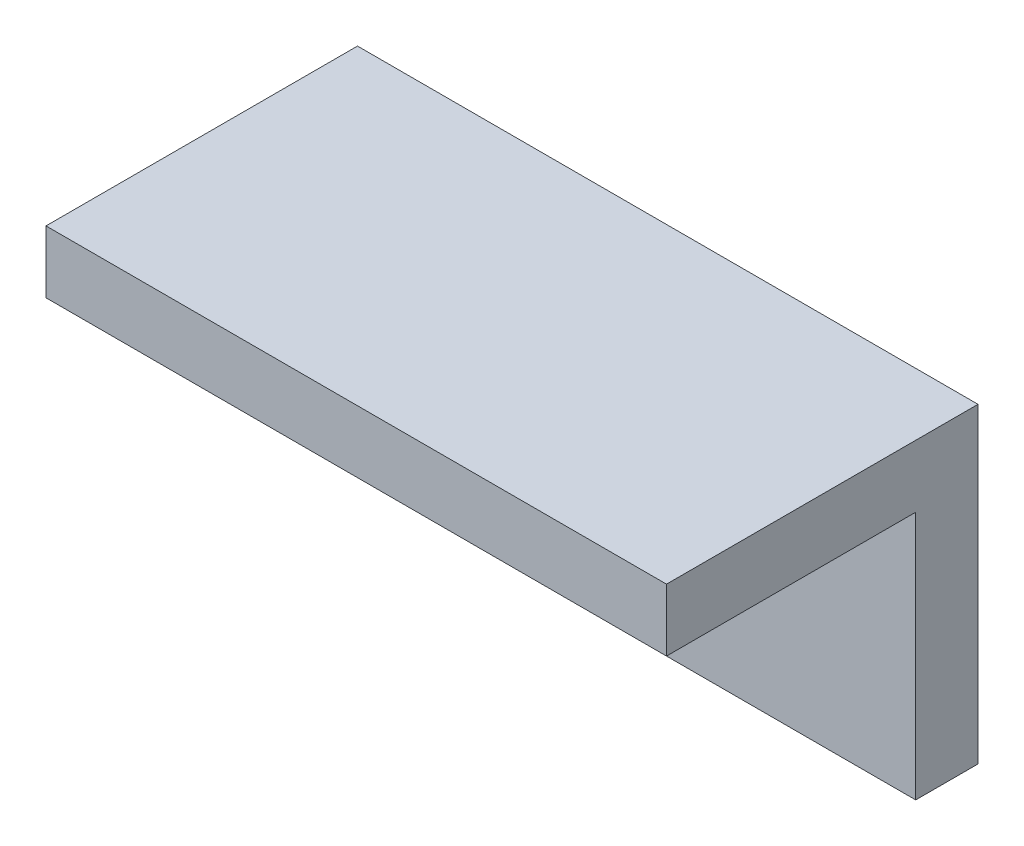
ISO-10303-21;
HEADER;
FILE_DESCRIPTION(('STEP AP214'),'2;1');
FILE_NAME('part.step','',(''),(''),'','','');
FILE_SCHEMA(('AUTOMOTIVE_DESIGN { 1 0 10303 214 1 1 1 1 }'));
ENDSEC;
DATA;
#1=APPLICATION_CONTEXT('core data for automotive mechanical design processes');
#2=APPLICATION_PROTOCOL_DEFINITION('international standard','automotive_design',2000,#1);
#3=PRODUCT_CONTEXT('',#1,'mechanical');
#4=PRODUCT('Part','Part','',(#3));
#5=PRODUCT_RELATED_PRODUCT_CATEGORY('part','',(#4));
#6=PRODUCT_DEFINITION_FORMATION('','',#4);
#7=PRODUCT_DEFINITION_CONTEXT('part definition',#1,'design');
#8=PRODUCT_DEFINITION('design','',#6,#7);
#9=PRODUCT_DEFINITION_SHAPE('','',#8);
#10=(LENGTH_UNIT() NAMED_UNIT(*) SI_UNIT(.MILLI.,.METRE.));
#11=(NAMED_UNIT(*) PLANE_ANGLE_UNIT() SI_UNIT($,.RADIAN.));
#12=(NAMED_UNIT(*) SI_UNIT($,.STERADIAN.) SOLID_ANGLE_UNIT());
#13=UNCERTAINTY_MEASURE_WITH_UNIT(LENGTH_MEASURE(1.E-05),#10,'distance_accuracy_value','');
#14=(GEOMETRIC_REPRESENTATION_CONTEXT(3) GLOBAL_UNCERTAINTY_ASSIGNED_CONTEXT((#13)) GLOBAL_UNIT_ASSIGNED_CONTEXT((#10,
#11,#12)) REPRESENTATION_CONTEXT('',''));
#15=CARTESIAN_POINT('',(0.,0.,0.));
#16=DIRECTION('',(0.,0.,1.));
#17=DIRECTION('',(1.,0.,0.));
#18=AXIS2_PLACEMENT_3D('',#15,#16,#17);
#19=CARTESIAN_POINT('',(31.623,0.,3.175));
#20=DIRECTION('',(0.,1.,0.));
#21=DIRECTION('',(0.,0.,1.));
#22=AXIS2_PLACEMENT_3D('',#19,#20,#21);
#23=PLANE('',#22);
#24=DIRECTION('',(0.,0.,-1.));
#25=VECTOR('',#24,1.);
#26=CARTESIAN_POINT('',(0.,0.,3.175));
#27=LINE('',#26,#25);
#28=CARTESIAN_POINT('',(0.,0.,3.175));
#29=VERTEX_POINT('',#28);
#30=CARTESIAN_POINT('',(0.,0.,0.));
#31=VERTEX_POINT('',#30);
#32=EDGE_CURVE('E128',#29,#31,#27,.T.);
#33=ORIENTED_EDGE('',*,*,#32,.T.);
#34=DIRECTION('',(-1.,0.,0.));
#35=VECTOR('',#34,1.);
#36=CARTESIAN_POINT('',(31.623,0.,0.));
#37=LINE('',#36,#35);
#38=CARTESIAN_POINT('',(31.623,0.,0.));
#39=VERTEX_POINT('',#38);
#40=EDGE_CURVE('E11',#39,#31,#37,.T.);
#41=ORIENTED_EDGE('',*,*,#40,.F.);
#42=DIRECTION('',(0.,0.,-1.));
#43=VECTOR('',#42,1.);
#44=CARTESIAN_POINT('',(31.623,0.,3.175));
#45=LINE('',#44,#43);
#46=CARTESIAN_POINT('',(31.623,0.,3.175));
#47=VERTEX_POINT('',#46);
#48=EDGE_CURVE('E144',#47,#39,#45,.T.);
#49=ORIENTED_EDGE('',*,*,#48,.F.);
#50=DIRECTION('',(-1.,0.,0.));
#51=VECTOR('',#50,1.);
#52=CARTESIAN_POINT('',(31.623,0.,3.175));
#53=LINE('',#52,#51);
#54=EDGE_CURVE('E124',#47,#29,#53,.T.);
#55=ORIENTED_EDGE('',*,*,#54,.T.);
#56=EDGE_LOOP('',(#33,#41,#49,#55));
#57=FACE_BOUND('',#56,.T.);
#58=ADVANCED_FACE('F39',(#57),#23,.F.);
#59=CARTESIAN_POINT('',(31.623,0.,0.));
#60=DIRECTION('',(0.,0.,1.));
#61=DIRECTION('',(1.,0.,0.));
#62=AXIS2_PLACEMENT_3D('',#59,#60,#61);
#63=PLANE('',#62);
#64=DIRECTION('',(0.,1.,0.));
#65=VECTOR('',#64,1.);
#66=CARTESIAN_POINT('',(0.,0.,0.));
#67=LINE('',#66,#65);
#68=CARTESIAN_POINT('',(0.,15.875,0.));
#69=VERTEX_POINT('',#68);
#70=EDGE_CURVE('E132',#31,#69,#67,.T.);
#71=ORIENTED_EDGE('',*,*,#70,.T.);
#72=DIRECTION('',(-1.,0.,0.));
#73=VECTOR('',#72,1.);
#74=CARTESIAN_POINT('',(31.623,15.875,0.));
#75=LINE('',#74,#73);
#76=CARTESIAN_POINT('',(31.623,15.875,0.));
#77=VERTEX_POINT('',#76);
#78=EDGE_CURVE('E48',#77,#69,#75,.T.);
#79=ORIENTED_EDGE('',*,*,#78,.F.);
#80=DIRECTION('',(0.,1.,0.));
#81=VECTOR('',#80,1.);
#82=CARTESIAN_POINT('',(31.623,0.,0.));
#83=LINE('',#82,#81);
#84=EDGE_CURVE('E93',#39,#77,#83,.T.);
#85=ORIENTED_EDGE('',*,*,#84,.F.);
#86=ORIENTED_EDGE('',*,*,#40,.T.);
#87=EDGE_LOOP('',(#71,#79,#85,#86));
#88=FACE_BOUND('',#87,.T.);
#89=ADVANCED_FACE('F172',(#88),#63,.F.);
#90=CARTESIAN_POINT('',(31.623,15.875,0.));
#91=DIRECTION('',(0.,-1.,0.));
#92=DIRECTION('',(0.,0.,-1.));
#93=AXIS2_PLACEMENT_3D('',#90,#91,#92);
#94=PLANE('',#93);
#95=DIRECTION('',(0.,0.,1.));
#96=VECTOR('',#95,1.);
#97=CARTESIAN_POINT('',(0.,15.875,0.));
#98=LINE('',#97,#96);
#99=CARTESIAN_POINT('',(0.,15.875,15.875));
#100=VERTEX_POINT('',#99);
#101=EDGE_CURVE('E135',#69,#100,#98,.T.);
#102=ORIENTED_EDGE('',*,*,#101,.T.);
#103=DIRECTION('',(-1.,0.,0.));
#104=VECTOR('',#103,1.);
#105=CARTESIAN_POINT('',(31.623,15.875,15.875));
#106=LINE('',#105,#104);
#107=CARTESIAN_POINT('',(31.623,15.875,15.875));
#108=VERTEX_POINT('',#107);
#109=EDGE_CURVE('E117',#108,#100,#106,.T.);
#110=ORIENTED_EDGE('',*,*,#109,.F.);
#111=DIRECTION('',(0.,0.,1.));
#112=VECTOR('',#111,1.);
#113=CARTESIAN_POINT('',(31.623,15.875,0.));
#114=LINE('',#113,#112);
#115=EDGE_CURVE('E106',#77,#108,#114,.T.);
#116=ORIENTED_EDGE('',*,*,#115,.F.);
#117=ORIENTED_EDGE('',*,*,#78,.T.);
#118=EDGE_LOOP('',(#102,#110,#116,#117));
#119=FACE_BOUND('',#118,.T.);
#120=ADVANCED_FACE('F154',(#119),#94,.F.);
#121=CARTESIAN_POINT('',(31.623,15.875,15.875));
#122=DIRECTION('',(0.,0.,-1.));
#123=DIRECTION('',(-1.,0.,0.));
#124=AXIS2_PLACEMENT_3D('',#121,#122,#123);
#125=PLANE('',#124);
#126=DIRECTION('',(0.,-1.,0.));
#127=VECTOR('',#126,1.);
#128=CARTESIAN_POINT('',(0.,15.875,15.875));
#129=LINE('',#128,#127);
#130=CARTESIAN_POINT('',(0.,12.7,15.875));
#131=VERTEX_POINT('',#130);
#132=EDGE_CURVE('E115',#100,#131,#129,.T.);
#133=ORIENTED_EDGE('',*,*,#132,.T.);
#134=DIRECTION('',(-1.,0.,0.));
#135=VECTOR('',#134,1.);
#136=CARTESIAN_POINT('',(31.623,12.7,15.875));
#137=LINE('',#136,#135);
#138=CARTESIAN_POINT('',(31.623,12.7,15.875));
#139=VERTEX_POINT('',#138);
#140=EDGE_CURVE('E112',#139,#131,#137,.T.);
#141=ORIENTED_EDGE('',*,*,#140,.F.);
#142=DIRECTION('',(0.,-1.,0.));
#143=VECTOR('',#142,1.);
#144=CARTESIAN_POINT('',(31.623,15.875,15.875));
#145=LINE('',#144,#143);
#146=EDGE_CURVE('E100',#108,#139,#145,.T.);
#147=ORIENTED_EDGE('',*,*,#146,.F.);
#148=ORIENTED_EDGE('',*,*,#109,.T.);
#149=EDGE_LOOP('',(#133,#141,#147,#148));
#150=FACE_BOUND('',#149,.T.);
#151=ADVANCED_FACE('F113',(#150),#125,.F.);
#152=CARTESIAN_POINT('',(31.623,12.7,15.875));
#153=DIRECTION('',(0.,1.,0.));
#154=DIRECTION('',(0.,0.,1.));
#155=AXIS2_PLACEMENT_3D('',#152,#153,#154);
#156=PLANE('',#155);
#157=DIRECTION('',(0.,0.,-1.));
#158=VECTOR('',#157,1.);
#159=CARTESIAN_POINT('',(0.,12.7,15.875));
#160=LINE('',#159,#158);
#161=CARTESIAN_POINT('',(0.,12.7,3.175));
#162=VERTEX_POINT('',#161);
#163=EDGE_CURVE('E79',#131,#162,#160,.T.);
#164=ORIENTED_EDGE('',*,*,#163,.T.);
#165=DIRECTION('',(-1.,0.,0.));
#166=VECTOR('',#165,1.);
#167=CARTESIAN_POINT('',(31.623,12.7,3.175));
#168=LINE('',#167,#166);
#169=CARTESIAN_POINT('',(31.623,12.7,3.175));
#170=VERTEX_POINT('',#169);
#171=EDGE_CURVE('E118',#170,#162,#168,.T.);
#172=ORIENTED_EDGE('',*,*,#171,.F.);
#173=DIRECTION('',(0.,0.,-1.));
#174=VECTOR('',#173,1.);
#175=CARTESIAN_POINT('',(31.623,12.7,15.875));
#176=LINE('',#175,#174);
#177=EDGE_CURVE('E104',#139,#170,#176,.T.);
#178=ORIENTED_EDGE('',*,*,#177,.F.);
#179=ORIENTED_EDGE('',*,*,#140,.T.);
#180=EDGE_LOOP('',(#164,#172,#178,#179));
#181=FACE_BOUND('',#180,.T.);
#182=ADVANCED_FACE('F120',(#181),#156,.F.);
#183=CARTESIAN_POINT('',(31.623,12.7,3.175));
#184=DIRECTION('',(0.,0.,-1.));
#185=DIRECTION('',(0.,1.,0.));
#186=AXIS2_PLACEMENT_3D('',#183,#184,#185);
#187=PLANE('',#186);
#188=DIRECTION('',(0.,-1.,0.));
#189=VECTOR('',#188,1.);
#190=CARTESIAN_POINT('',(0.,12.7,3.175));
#191=LINE('',#190,#189);
#192=EDGE_CURVE('E85',#162,#29,#191,.T.);
#193=ORIENTED_EDGE('',*,*,#192,.T.);
#194=ORIENTED_EDGE('',*,*,#54,.F.);
#195=DIRECTION('',(0.,-1.,0.));
#196=VECTOR('',#195,1.);
#197=CARTESIAN_POINT('',(31.623,12.7,3.175));
#198=LINE('',#197,#196);
#199=EDGE_CURVE('E56',#170,#47,#198,.T.);
#200=ORIENTED_EDGE('',*,*,#199,.F.);
#201=ORIENTED_EDGE('',*,*,#171,.T.);
#202=EDGE_LOOP('',(#193,#194,#200,#201));
#203=FACE_BOUND('',#202,.T.);
#204=ADVANCED_FACE('F161',(#203),#187,.F.);
#205=CARTESIAN_POINT('',(31.623,0.,0.));
#206=DIRECTION('',(1.,0.,0.));
#207=DIRECTION('',(0.,0.,-1.));
#208=AXIS2_PLACEMENT_3D('',#205,#206,#207);
#209=PLANE('',#208);
#210=ORIENTED_EDGE('',*,*,#48,.T.);
#211=ORIENTED_EDGE('',*,*,#84,.T.);
#212=ORIENTED_EDGE('',*,*,#115,.T.);
#213=ORIENTED_EDGE('',*,*,#146,.T.);
#214=ORIENTED_EDGE('',*,*,#177,.T.);
#215=ORIENTED_EDGE('',*,*,#199,.T.);
#216=EDGE_LOOP('',(#210,#211,#212,#213,#214,#215));
#217=FACE_BOUND('',#216,.T.);
#218=ADVANCED_FACE('F102',(#217),#209,.T.);
#219=CARTESIAN_POINT('',(0.,0.,0.));
#220=DIRECTION('',(1.,0.,0.));
#221=DIRECTION('',(0.,0.,-1.));
#222=AXIS2_PLACEMENT_3D('',#219,#220,#221);
#223=PLANE('',#222);
#224=ORIENTED_EDGE('',*,*,#32,.F.);
#225=ORIENTED_EDGE('',*,*,#192,.F.);
#226=ORIENTED_EDGE('',*,*,#163,.F.);
#227=ORIENTED_EDGE('',*,*,#132,.F.);
#228=ORIENTED_EDGE('',*,*,#101,.F.);
#229=ORIENTED_EDGE('',*,*,#70,.F.);
#230=EDGE_LOOP('',(#224,#225,#226,#227,#228,#229));
#231=FACE_BOUND('',#230,.T.);
#232=ADVANCED_FACE('F157',(#231),#223,.F.);
#233=CLOSED_SHELL('',(#58,#89,#120,#151,#182,#204,#218,#232));
#234=MANIFOLD_SOLID_BREP('B2',#233);
#235=ADVANCED_BREP_SHAPE_REPRESENTATION('',(#18,#234),#14);
#236=SHAPE_DEFINITION_REPRESENTATION(#9,#235);
ENDSEC;
END-ISO-10303-21;
